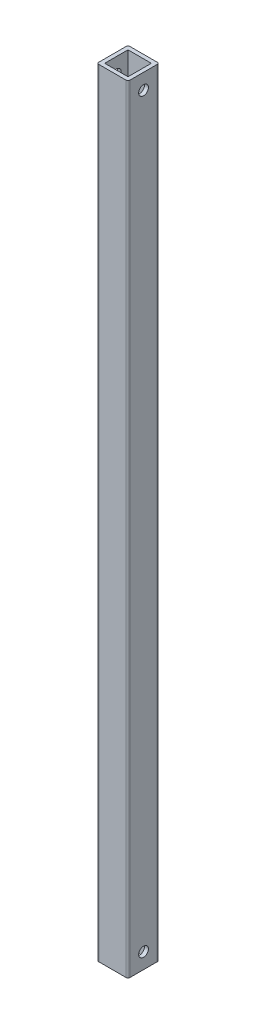
ISO-10303-21;
HEADER;
FILE_DESCRIPTION(('STEP AP214'),'2;1');
FILE_NAME('part.step','',(''),(''),'','','');
FILE_SCHEMA(('AUTOMOTIVE_DESIGN { 1 0 10303 214 1 1 1 1 }'));
ENDSEC;
DATA;
#1=APPLICATION_CONTEXT('core data for automotive mechanical design processes');
#2=APPLICATION_PROTOCOL_DEFINITION('international standard','automotive_design',2000,#1);
#3=PRODUCT_CONTEXT('',#1,'mechanical');
#4=PRODUCT('Part','Part','',(#3));
#5=PRODUCT_RELATED_PRODUCT_CATEGORY('part','',(#4));
#6=PRODUCT_DEFINITION_FORMATION('','',#4);
#7=PRODUCT_DEFINITION_CONTEXT('part definition',#1,'design');
#8=PRODUCT_DEFINITION('design','',#6,#7);
#9=PRODUCT_DEFINITION_SHAPE('','',#8);
#10=(LENGTH_UNIT() NAMED_UNIT(*) SI_UNIT(.MILLI.,.METRE.));
#11=(NAMED_UNIT(*) PLANE_ANGLE_UNIT() SI_UNIT($,.RADIAN.));
#12=(NAMED_UNIT(*) SI_UNIT($,.STERADIAN.) SOLID_ANGLE_UNIT());
#13=UNCERTAINTY_MEASURE_WITH_UNIT(LENGTH_MEASURE(1.E-05),#10,'distance_accuracy_value','');
#14=(GEOMETRIC_REPRESENTATION_CONTEXT(3) GLOBAL_UNCERTAINTY_ASSIGNED_CONTEXT((#13)) GLOBAL_UNIT_ASSIGNED_CONTEXT((#10,
#11,#12)) REPRESENTATION_CONTEXT('',''));
#15=CARTESIAN_POINT('',(0.,0.,0.));
#16=DIRECTION('',(0.,0.,1.));
#17=DIRECTION('',(1.,0.,0.));
#18=AXIS2_PLACEMENT_3D('',#15,#16,#17);
#19=CARTESIAN_POINT('',(0.,400.,0.));
#20=DIRECTION('',(0.,1.,0.));
#21=DIRECTION('',(0.,0.,1.));
#22=AXIS2_PLACEMENT_3D('',#19,#20,#21);
#23=PLANE('',#22);
#24=DIRECTION('',(0.,0.,1.));
#25=VECTOR('',#24,1.);
#26=CARTESIAN_POINT('',(-3.14814814814815,400.,-8.92592592592593));
#27=LINE('',#26,#25);
#28=CARTESIAN_POINT('',(-3.14814814814815,400.,-7.92592592592593));
#29=VERTEX_POINT('',#28);
#30=CARTESIAN_POINT('',(-3.14814814814814,400.,6.07407407407407));
#31=VERTEX_POINT('',#30);
#32=EDGE_CURVE('E198',#29,#31,#27,.T.);
#33=ORIENTED_EDGE('',*,*,#32,.T.);
#34=CARTESIAN_POINT('',(-2.14814814814814,400.,6.07407407407407));
#35=DIRECTION('',(0.,1.,0.));
#36=DIRECTION('',(0.,0.,1.));
#37=AXIS2_PLACEMENT_3D('',#34,#35,#36);
#38=CIRCLE('',#37,1.);
#39=CARTESIAN_POINT('',(-2.14814814814814,400.,7.07407407407407));
#40=VERTEX_POINT('',#39);
#41=EDGE_CURVE('E260',#31,#40,#38,.T.);
#42=ORIENTED_EDGE('',*,*,#41,.T.);
#43=DIRECTION('',(1.,0.,0.));
#44=VECTOR('',#43,1.);
#45=CARTESIAN_POINT('',(-3.14814814814814,400.,7.07407407407407));
#46=LINE('',#45,#44);
#47=CARTESIAN_POINT('',(11.8518518518519,400.,7.07407407407407));
#48=VERTEX_POINT('',#47);
#49=EDGE_CURVE('E202',#40,#48,#46,.T.);
#50=ORIENTED_EDGE('',*,*,#49,.T.);
#51=CARTESIAN_POINT('',(11.8518518518519,400.,6.07407407407407));
#52=DIRECTION('',(0.,1.,0.));
#53=DIRECTION('',(0.,0.,1.));
#54=AXIS2_PLACEMENT_3D('',#51,#52,#53);
#55=CIRCLE('',#54,1.);
#56=CARTESIAN_POINT('',(12.8518518518519,400.,6.07407407407407));
#57=VERTEX_POINT('',#56);
#58=EDGE_CURVE('E252',#48,#57,#55,.T.);
#59=ORIENTED_EDGE('',*,*,#58,.T.);
#60=DIRECTION('',(0.,0.,-1.));
#61=VECTOR('',#60,1.);
#62=CARTESIAN_POINT('',(12.8518518518519,400.,-8.92592592592593));
#63=LINE('',#62,#61);
#64=CARTESIAN_POINT('',(12.8518518518519,400.,-7.92592592592593));
#65=VERTEX_POINT('',#64);
#66=EDGE_CURVE('E207',#57,#65,#63,.T.);
#67=ORIENTED_EDGE('',*,*,#66,.T.);
#68=CARTESIAN_POINT('',(11.8518518518519,400.,-7.92592592592593));
#69=DIRECTION('',(0.,1.,0.));
#70=DIRECTION('',(0.,0.,1.));
#71=AXIS2_PLACEMENT_3D('',#68,#69,#70);
#72=CIRCLE('',#71,1.);
#73=CARTESIAN_POINT('',(11.8518518518519,400.,-8.92592592592593));
#74=VERTEX_POINT('',#73);
#75=EDGE_CURVE('E74',#65,#74,#72,.T.);
#76=ORIENTED_EDGE('',*,*,#75,.T.);
#77=DIRECTION('',(-1.,0.,0.));
#78=VECTOR('',#77,1.);
#79=CARTESIAN_POINT('',(-3.14814814814815,400.,-8.92592592592593));
#80=LINE('',#79,#78);
#81=CARTESIAN_POINT('',(-2.14814814814815,400.,-8.92592592592593));
#82=VERTEX_POINT('',#81);
#83=EDGE_CURVE('E210',#74,#82,#80,.T.);
#84=ORIENTED_EDGE('',*,*,#83,.T.);
#85=CARTESIAN_POINT('',(-2.14814814814815,400.,-7.92592592592593));
#86=DIRECTION('',(0.,1.,0.));
#87=DIRECTION('',(0.,0.,1.));
#88=AXIS2_PLACEMENT_3D('',#85,#86,#87);
#89=CIRCLE('',#88,1.);
#90=EDGE_CURVE('E255',#82,#29,#89,.T.);
#91=ORIENTED_EDGE('',*,*,#90,.T.);
#92=EDGE_LOOP('',(#33,#42,#50,#59,#67,#76,#84,#91));
#93=FACE_BOUND('',#92,.T.);
#94=DIRECTION('',(0.,0.,1.));
#95=VECTOR('',#94,1.);
#96=CARTESIAN_POINT('',(-1.14814814814815,400.,-6.92592592592593));
#97=LINE('',#96,#95);
#98=CARTESIAN_POINT('',(-1.14814814814815,400.,-6.92592592592593));
#99=VERTEX_POINT('',#98);
#100=CARTESIAN_POINT('',(-1.14814814814814,400.,5.07407407407407));
#101=VERTEX_POINT('',#100);
#102=EDGE_CURVE('E154',#99,#101,#97,.T.);
#103=ORIENTED_EDGE('',*,*,#102,.F.);
#104=DIRECTION('',(-1.,0.,0.));
#105=VECTOR('',#104,1.);
#106=CARTESIAN_POINT('',(-1.14814814814815,400.,-6.92592592592593));
#107=LINE('',#106,#105);
#108=CARTESIAN_POINT('',(10.8518518518519,400.,-6.92592592592593));
#109=VERTEX_POINT('',#108);
#110=EDGE_CURVE('E143',#109,#99,#107,.T.);
#111=ORIENTED_EDGE('',*,*,#110,.F.);
#112=DIRECTION('',(0.,0.,-1.));
#113=VECTOR('',#112,1.);
#114=CARTESIAN_POINT('',(10.8518518518519,400.,-6.92592592592593));
#115=LINE('',#114,#113);
#116=CARTESIAN_POINT('',(10.8518518518519,400.,5.07407407407407));
#117=VERTEX_POINT('',#116);
#118=EDGE_CURVE('E172',#117,#109,#115,.T.);
#119=ORIENTED_EDGE('',*,*,#118,.F.);
#120=DIRECTION('',(1.,0.,0.));
#121=VECTOR('',#120,1.);
#122=CARTESIAN_POINT('',(-1.14814814814814,400.,5.07407407407407));
#123=LINE('',#122,#121);
#124=EDGE_CURVE('E168',#101,#117,#123,.T.);
#125=ORIENTED_EDGE('',*,*,#124,.F.);
#126=EDGE_LOOP('',(#103,#111,#119,#125));
#127=FACE_BOUND('',#126,.T.);
#128=ADVANCED_FACE('F49',(#93,#127),#23,.T.);
#129=CARTESIAN_POINT('',(0.,0.,0.));
#130=DIRECTION('',(0.,1.,0.));
#131=DIRECTION('',(0.,0.,1.));
#132=AXIS2_PLACEMENT_3D('',#129,#130,#131);
#133=PLANE('',#132);
#134=DIRECTION('',(1.,0.,0.));
#135=VECTOR('',#134,1.);
#136=CARTESIAN_POINT('',(-3.14814814814814,0.,7.07407407407407));
#137=LINE('',#136,#135);
#138=CARTESIAN_POINT('',(-2.14814814814814,0.,7.07407407407407));
#139=VERTEX_POINT('',#138);
#140=CARTESIAN_POINT('',(11.8518518518519,0.,7.07407407407407));
#141=VERTEX_POINT('',#140);
#142=EDGE_CURVE('E217',#139,#141,#137,.T.);
#143=ORIENTED_EDGE('',*,*,#142,.F.);
#144=CARTESIAN_POINT('',(-2.14814814814814,0.,6.07407407407407));
#145=DIRECTION('',(0.,1.,0.));
#146=DIRECTION('',(0.,0.,1.));
#147=AXIS2_PLACEMENT_3D('',#144,#145,#146);
#148=CIRCLE('',#147,1.);
#149=CARTESIAN_POINT('',(-3.14814814814814,0.,6.07407407407407));
#150=VERTEX_POINT('',#149);
#151=EDGE_CURVE('E242',#139,#150,#148,.F.);
#152=ORIENTED_EDGE('',*,*,#151,.T.);
#153=DIRECTION('',(0.,0.,1.));
#154=VECTOR('',#153,1.);
#155=CARTESIAN_POINT('',(-3.14814814814815,0.,-8.92592592592593));
#156=LINE('',#155,#154);
#157=CARTESIAN_POINT('',(-3.14814814814815,0.,-7.92592592592593));
#158=VERTEX_POINT('',#157);
#159=EDGE_CURVE('E163',#158,#150,#156,.T.);
#160=ORIENTED_EDGE('',*,*,#159,.F.);
#161=CARTESIAN_POINT('',(-2.14814814814815,0.,-7.92592592592593));
#162=DIRECTION('',(0.,1.,0.));
#163=DIRECTION('',(0.,0.,1.));
#164=AXIS2_PLACEMENT_3D('',#161,#162,#163);
#165=CIRCLE('',#164,1.);
#166=CARTESIAN_POINT('',(-2.14814814814815,0.,-8.92592592592593));
#167=VERTEX_POINT('',#166);
#168=EDGE_CURVE('E236',#158,#167,#165,.F.);
#169=ORIENTED_EDGE('',*,*,#168,.T.);
#170=DIRECTION('',(-1.,0.,0.));
#171=VECTOR('',#170,1.);
#172=CARTESIAN_POINT('',(-3.14814814814815,0.,-8.92592592592593));
#173=LINE('',#172,#171);
#174=CARTESIAN_POINT('',(11.8518518518519,0.,-8.92592592592593));
#175=VERTEX_POINT('',#174);
#176=EDGE_CURVE('E203',#175,#167,#173,.T.);
#177=ORIENTED_EDGE('',*,*,#176,.F.);
#178=CARTESIAN_POINT('',(11.8518518518519,0.,-7.92592592592593));
#179=DIRECTION('',(0.,1.,0.));
#180=DIRECTION('',(0.,0.,1.));
#181=AXIS2_PLACEMENT_3D('',#178,#179,#180);
#182=CIRCLE('',#181,1.);
#183=CARTESIAN_POINT('',(12.8518518518519,0.,-7.92592592592593));
#184=VERTEX_POINT('',#183);
#185=EDGE_CURVE('E239',#175,#184,#182,.F.);
#186=ORIENTED_EDGE('',*,*,#185,.T.);
#187=DIRECTION('',(0.,0.,-1.));
#188=VECTOR('',#187,1.);
#189=CARTESIAN_POINT('',(12.8518518518519,0.,-8.92592592592593));
#190=LINE('',#189,#188);
#191=CARTESIAN_POINT('',(12.8518518518519,0.,6.07407407407407));
#192=VERTEX_POINT('',#191);
#193=EDGE_CURVE('E221',#192,#184,#190,.T.);
#194=ORIENTED_EDGE('',*,*,#193,.F.);
#195=CARTESIAN_POINT('',(11.8518518518519,0.,6.07407407407407));
#196=DIRECTION('',(0.,1.,0.));
#197=DIRECTION('',(0.,0.,1.));
#198=AXIS2_PLACEMENT_3D('',#195,#196,#197);
#199=CIRCLE('',#198,1.);
#200=EDGE_CURVE('E233',#192,#141,#199,.F.);
#201=ORIENTED_EDGE('',*,*,#200,.T.);
#202=EDGE_LOOP('',(#143,#152,#160,#169,#177,#186,#194,#201));
#203=FACE_BOUND('',#202,.T.);
#204=DIRECTION('',(-1.,0.,0.));
#205=VECTOR('',#204,1.);
#206=CARTESIAN_POINT('',(-1.14814814814815,0.,-6.92592592592593));
#207=LINE('',#206,#205);
#208=CARTESIAN_POINT('',(10.8518518518519,0.,-6.92592592592593));
#209=VERTEX_POINT('',#208);
#210=CARTESIAN_POINT('',(-1.14814814814815,0.,-6.92592592592593));
#211=VERTEX_POINT('',#210);
#212=EDGE_CURVE('E178',#209,#211,#207,.T.);
#213=ORIENTED_EDGE('',*,*,#212,.T.);
#214=DIRECTION('',(0.,0.,1.));
#215=VECTOR('',#214,1.);
#216=CARTESIAN_POINT('',(-1.14814814814815,0.,-6.92592592592593));
#217=LINE('',#216,#215);
#218=CARTESIAN_POINT('',(-1.14814814814814,0.,5.07407407407407));
#219=VERTEX_POINT('',#218);
#220=EDGE_CURVE('E161',#211,#219,#217,.T.);
#221=ORIENTED_EDGE('',*,*,#220,.T.);
#222=DIRECTION('',(1.,0.,0.));
#223=VECTOR('',#222,1.);
#224=CARTESIAN_POINT('',(-1.14814814814814,0.,5.07407407407407));
#225=LINE('',#224,#223);
#226=CARTESIAN_POINT('',(10.8518518518519,0.,5.07407407407407));
#227=VERTEX_POINT('',#226);
#228=EDGE_CURVE('E184',#219,#227,#225,.T.);
#229=ORIENTED_EDGE('',*,*,#228,.T.);
#230=DIRECTION('',(0.,0.,-1.));
#231=VECTOR('',#230,1.);
#232=CARTESIAN_POINT('',(10.8518518518519,0.,-6.92592592592593));
#233=LINE('',#232,#231);
#234=EDGE_CURVE('E155',#227,#209,#233,.T.);
#235=ORIENTED_EDGE('',*,*,#234,.T.);
#236=EDGE_LOOP('',(#213,#221,#229,#235));
#237=FACE_BOUND('',#236,.T.);
#238=ADVANCED_FACE('F319',(#203,#237),#133,.F.);
#239=CARTESIAN_POINT('',(-3.14814814814815,400.,-8.92592592592593));
#240=DIRECTION('',(1.,0.,0.));
#241=DIRECTION('',(0.,0.,-1.));
#242=AXIS2_PLACEMENT_3D('',#239,#240,#241);
#243=PLANE('',#242);
#244=CARTESIAN_POINT('',(-3.14814814814815,8.00000000000001,-0.925925925925927));
#245=DIRECTION('',(-1.,0.,0.));
#246=DIRECTION('',(0.,0.,1.));
#247=AXIS2_PLACEMENT_3D('',#244,#245,#246);
#248=CIRCLE('',#247,2.5);
#249=CARTESIAN_POINT('',(-3.14814814814815,8.00000000000001,1.57407407407407));
#250=VERTEX_POINT('',#249);
#251=EDGE_CURVE('E283',#250,#250,#248,.T.);
#252=ORIENTED_EDGE('',*,*,#251,.F.);
#253=EDGE_LOOP('',(#252));
#254=FACE_BOUND('',#253,.T.);
#255=CARTESIAN_POINT('',(-3.14814814814815,392.,-0.925925925925927));
#256=DIRECTION('',(-1.,0.,0.));
#257=DIRECTION('',(0.,0.,1.));
#258=AXIS2_PLACEMENT_3D('',#255,#256,#257);
#259=CIRCLE('',#258,2.5);
#260=CARTESIAN_POINT('',(-3.14814814814815,392.,1.57407407407407));
#261=VERTEX_POINT('',#260);
#262=EDGE_CURVE('E289',#261,#261,#259,.T.);
#263=ORIENTED_EDGE('',*,*,#262,.F.);
#264=EDGE_LOOP('',(#263));
#265=FACE_BOUND('',#264,.T.);
#266=ORIENTED_EDGE('',*,*,#159,.T.);
#267=DIRECTION('',(0.,-1.,0.));
#268=VECTOR('',#267,1.);
#269=CARTESIAN_POINT('',(-3.14814814814814,400.,6.07407407407407));
#270=LINE('',#269,#268);
#271=EDGE_CURVE('E249',#150,#31,#270,.F.);
#272=ORIENTED_EDGE('',*,*,#271,.T.);
#273=ORIENTED_EDGE('',*,*,#32,.F.);
#274=DIRECTION('',(0.,-1.,0.));
#275=VECTOR('',#274,1.);
#276=CARTESIAN_POINT('',(-3.14814814814815,400.,-7.92592592592593));
#277=LINE('',#276,#275);
#278=EDGE_CURVE('E245',#29,#158,#277,.T.);
#279=ORIENTED_EDGE('',*,*,#278,.T.);
#280=EDGE_LOOP('',(#266,#272,#273,#279));
#281=FACE_BOUND('',#280,.T.);
#282=ADVANCED_FACE('F333',(#254,#265,#281),#243,.F.);
#283=CARTESIAN_POINT('',(-3.14814814814814,400.,7.07407407407407));
#284=DIRECTION('',(0.,0.,-1.));
#285=DIRECTION('',(-1.,0.,0.));
#286=AXIS2_PLACEMENT_3D('',#283,#284,#285);
#287=PLANE('',#286);
#288=ORIENTED_EDGE('',*,*,#49,.F.);
#289=DIRECTION('',(0.,-1.,0.));
#290=VECTOR('',#289,1.);
#291=CARTESIAN_POINT('',(-2.14814814814814,400.,7.07407407407407));
#292=LINE('',#291,#290);
#293=EDGE_CURVE('E229',#40,#139,#292,.T.);
#294=ORIENTED_EDGE('',*,*,#293,.T.);
#295=ORIENTED_EDGE('',*,*,#142,.T.);
#296=DIRECTION('',(0.,-1.,0.));
#297=VECTOR('',#296,1.);
#298=CARTESIAN_POINT('',(11.8518518518519,400.,7.07407407407407));
#299=LINE('',#298,#297);
#300=EDGE_CURVE('E213',#141,#48,#299,.F.);
#301=ORIENTED_EDGE('',*,*,#300,.T.);
#302=EDGE_LOOP('',(#288,#294,#295,#301));
#303=FACE_BOUND('',#302,.T.);
#304=ADVANCED_FACE('F344',(#303),#287,.F.);
#305=CARTESIAN_POINT('',(12.8518518518519,400.,-8.92592592592593));
#306=DIRECTION('',(-1.,0.,0.));
#307=DIRECTION('',(0.,0.,1.));
#308=AXIS2_PLACEMENT_3D('',#305,#306,#307);
#309=PLANE('',#308);
#310=CARTESIAN_POINT('',(12.8518518518519,8.00000000000001,-0.925925925925929));
#311=DIRECTION('',(-1.,0.,0.));
#312=DIRECTION('',(0.,0.,1.));
#313=AXIS2_PLACEMENT_3D('',#310,#311,#312);
#314=CIRCLE('',#313,2.5);
#315=CARTESIAN_POINT('',(12.8518518518519,8.00000000000001,1.57407407407407));
#316=VERTEX_POINT('',#315);
#317=EDGE_CURVE('E275',#316,#316,#314,.T.);
#318=ORIENTED_EDGE('',*,*,#317,.T.);
#319=EDGE_LOOP('',(#318));
#320=FACE_BOUND('',#319,.T.);
#321=CARTESIAN_POINT('',(12.8518518518519,392.,-0.925925925925929));
#322=DIRECTION('',(-1.,0.,0.));
#323=DIRECTION('',(0.,0.,1.));
#324=AXIS2_PLACEMENT_3D('',#321,#322,#323);
#325=CIRCLE('',#324,2.5);
#326=CARTESIAN_POINT('',(12.8518518518519,392.,1.57407407407407));
#327=VERTEX_POINT('',#326);
#328=EDGE_CURVE('E295',#327,#327,#325,.T.);
#329=ORIENTED_EDGE('',*,*,#328,.T.);
#330=EDGE_LOOP('',(#329));
#331=FACE_BOUND('',#330,.T.);
#332=ORIENTED_EDGE('',*,*,#193,.T.);
#333=DIRECTION('',(0.,-1.,0.));
#334=VECTOR('',#333,1.);
#335=CARTESIAN_POINT('',(12.8518518518519,400.,-7.92592592592593));
#336=LINE('',#335,#334);
#337=EDGE_CURVE('E11',#184,#65,#336,.F.);
#338=ORIENTED_EDGE('',*,*,#337,.T.);
#339=ORIENTED_EDGE('',*,*,#66,.F.);
#340=DIRECTION('',(0.,-1.,0.));
#341=VECTOR('',#340,1.);
#342=CARTESIAN_POINT('',(12.8518518518519,400.,6.07407407407407));
#343=LINE('',#342,#341);
#344=EDGE_CURVE('E59',#57,#192,#343,.T.);
#345=ORIENTED_EDGE('',*,*,#344,.T.);
#346=EDGE_LOOP('',(#332,#338,#339,#345));
#347=FACE_BOUND('',#346,.T.);
#348=ADVANCED_FACE('F341',(#320,#331,#347),#309,.F.);
#349=CARTESIAN_POINT('',(-3.14814814814815,400.,-8.92592592592593));
#350=DIRECTION('',(0.,0.,1.));
#351=DIRECTION('',(1.,0.,0.));
#352=AXIS2_PLACEMENT_3D('',#349,#350,#351);
#353=PLANE('',#352);
#354=ORIENTED_EDGE('',*,*,#83,.F.);
#355=DIRECTION('',(0.,-1.,0.));
#356=VECTOR('',#355,1.);
#357=CARTESIAN_POINT('',(11.8518518518519,400.,-8.92592592592593));
#358=LINE('',#357,#356);
#359=EDGE_CURVE('E265',#74,#175,#358,.T.);
#360=ORIENTED_EDGE('',*,*,#359,.T.);
#361=ORIENTED_EDGE('',*,*,#176,.T.);
#362=DIRECTION('',(0.,-1.,0.));
#363=VECTOR('',#362,1.);
#364=CARTESIAN_POINT('',(-2.14814814814815,400.,-8.92592592592593));
#365=LINE('',#364,#363);
#366=EDGE_CURVE('E67',#167,#82,#365,.F.);
#367=ORIENTED_EDGE('',*,*,#366,.T.);
#368=EDGE_LOOP('',(#354,#360,#361,#367));
#369=FACE_BOUND('',#368,.T.);
#370=ADVANCED_FACE('F338',(#369),#353,.F.);
#371=CARTESIAN_POINT('',(-1.14814814814815,400.,-6.92592592592593));
#372=DIRECTION('',(0.,0.,1.));
#373=DIRECTION('',(1.,0.,0.));
#374=AXIS2_PLACEMENT_3D('',#371,#372,#373);
#375=PLANE('',#374);
#376=ORIENTED_EDGE('',*,*,#212,.F.);
#377=DIRECTION('',(0.,-1.,0.));
#378=VECTOR('',#377,1.);
#379=CARTESIAN_POINT('',(10.8518518518519,400.,-6.92592592592593));
#380=LINE('',#379,#378);
#381=EDGE_CURVE('E149',#109,#209,#380,.T.);
#382=ORIENTED_EDGE('',*,*,#381,.F.);
#383=ORIENTED_EDGE('',*,*,#110,.T.);
#384=DIRECTION('',(0.,-1.,0.));
#385=VECTOR('',#384,1.);
#386=CARTESIAN_POINT('',(-1.14814814814815,400.,-6.92592592592593));
#387=LINE('',#386,#385);
#388=EDGE_CURVE('E146',#99,#211,#387,.T.);
#389=ORIENTED_EDGE('',*,*,#388,.T.);
#390=EDGE_LOOP('',(#376,#382,#383,#389));
#391=FACE_BOUND('',#390,.T.);
#392=ADVANCED_FACE('F145',(#391),#375,.T.);
#393=CARTESIAN_POINT('',(-1.14814814814815,400.,-6.92592592592593));
#394=DIRECTION('',(1.,0.,0.));
#395=DIRECTION('',(0.,0.,-1.));
#396=AXIS2_PLACEMENT_3D('',#393,#394,#395);
#397=PLANE('',#396);
#398=CARTESIAN_POINT('',(-1.14814814814815,8.00000000000001,-0.925925925925927));
#399=DIRECTION('',(1.,0.,0.));
#400=DIRECTION('',(0.,0.,-1.));
#401=AXIS2_PLACEMENT_3D('',#398,#399,#400);
#402=CIRCLE('',#401,2.5);
#403=CARTESIAN_POINT('',(-1.14814814814815,8.00000000000001,-3.42592592592593));
#404=VERTEX_POINT('',#403);
#405=EDGE_CURVE('E181',#404,#404,#402,.T.);
#406=ORIENTED_EDGE('',*,*,#405,.F.);
#407=EDGE_LOOP('',(#406));
#408=FACE_BOUND('',#407,.T.);
#409=CARTESIAN_POINT('',(-1.14814814814815,392.,-0.925925925925927));
#410=DIRECTION('',(1.,0.,0.));
#411=DIRECTION('',(0.,0.,-1.));
#412=AXIS2_PLACEMENT_3D('',#409,#410,#411);
#413=CIRCLE('',#412,2.5);
#414=CARTESIAN_POINT('',(-1.14814814814815,392.,-3.42592592592593));
#415=VERTEX_POINT('',#414);
#416=EDGE_CURVE('E274',#415,#415,#413,.T.);
#417=ORIENTED_EDGE('',*,*,#416,.F.);
#418=EDGE_LOOP('',(#417));
#419=FACE_BOUND('',#418,.T.);
#420=ORIENTED_EDGE('',*,*,#220,.F.);
#421=ORIENTED_EDGE('',*,*,#388,.F.);
#422=ORIENTED_EDGE('',*,*,#102,.T.);
#423=DIRECTION('',(0.,-1.,0.));
#424=VECTOR('',#423,1.);
#425=CARTESIAN_POINT('',(-1.14814814814814,400.,5.07407407407407));
#426=LINE('',#425,#424);
#427=EDGE_CURVE('E164',#101,#219,#426,.T.);
#428=ORIENTED_EDGE('',*,*,#427,.T.);
#429=EDGE_LOOP('',(#420,#421,#422,#428));
#430=FACE_BOUND('',#429,.T.);
#431=ADVANCED_FACE('F158',(#408,#419,#430),#397,.T.);
#432=CARTESIAN_POINT('',(-1.14814814814814,400.,5.07407407407407));
#433=DIRECTION('',(0.,0.,-1.));
#434=DIRECTION('',(-1.,0.,0.));
#435=AXIS2_PLACEMENT_3D('',#432,#433,#434);
#436=PLANE('',#435);
#437=ORIENTED_EDGE('',*,*,#228,.F.);
#438=ORIENTED_EDGE('',*,*,#427,.F.);
#439=ORIENTED_EDGE('',*,*,#124,.T.);
#440=DIRECTION('',(0.,-1.,0.));
#441=VECTOR('',#440,1.);
#442=CARTESIAN_POINT('',(10.8518518518519,400.,5.07407407407407));
#443=LINE('',#442,#441);
#444=EDGE_CURVE('E193',#117,#227,#443,.T.);
#445=ORIENTED_EDGE('',*,*,#444,.T.);
#446=EDGE_LOOP('',(#437,#438,#439,#445));
#447=FACE_BOUND('',#446,.T.);
#448=ADVANCED_FACE('F313',(#447),#436,.T.);
#449=CARTESIAN_POINT('',(10.8518518518519,400.,-6.92592592592593));
#450=DIRECTION('',(-1.,0.,0.));
#451=DIRECTION('',(0.,0.,1.));
#452=AXIS2_PLACEMENT_3D('',#449,#450,#451);
#453=PLANE('',#452);
#454=CARTESIAN_POINT('',(10.8518518518519,8.00000000000001,-0.925925925925928));
#455=DIRECTION('',(-1.,0.,0.));
#456=DIRECTION('',(0.,0.,1.));
#457=AXIS2_PLACEMENT_3D('',#454,#455,#456);
#458=CIRCLE('',#457,2.5);
#459=CARTESIAN_POINT('',(10.8518518518519,8.00000000000001,1.57407407407407));
#460=VERTEX_POINT('',#459);
#461=EDGE_CURVE('E53',#460,#460,#458,.T.);
#462=ORIENTED_EDGE('',*,*,#461,.F.);
#463=EDGE_LOOP('',(#462));
#464=FACE_BOUND('',#463,.T.);
#465=CARTESIAN_POINT('',(10.8518518518519,392.,-0.925925925925928));
#466=DIRECTION('',(-1.,0.,0.));
#467=DIRECTION('',(0.,0.,1.));
#468=AXIS2_PLACEMENT_3D('',#465,#466,#467);
#469=CIRCLE('',#468,2.5);
#470=CARTESIAN_POINT('',(10.8518518518519,392.,1.57407407407407));
#471=VERTEX_POINT('',#470);
#472=EDGE_CURVE('E271',#471,#471,#469,.T.);
#473=ORIENTED_EDGE('',*,*,#472,.F.);
#474=EDGE_LOOP('',(#473));
#475=FACE_BOUND('',#474,.T.);
#476=ORIENTED_EDGE('',*,*,#234,.F.);
#477=ORIENTED_EDGE('',*,*,#444,.F.);
#478=ORIENTED_EDGE('',*,*,#118,.T.);
#479=ORIENTED_EDGE('',*,*,#381,.T.);
#480=EDGE_LOOP('',(#476,#477,#478,#479));
#481=FACE_BOUND('',#480,.T.);
#482=ADVANCED_FACE('F309',(#464,#475,#481),#453,.T.);
#483=CARTESIAN_POINT('',(-2.14814814814814,400.,6.07407407407407));
#484=DIRECTION('',(0.,-1.,0.));
#485=DIRECTION('',(0.,0.,-1.));
#486=AXIS2_PLACEMENT_3D('',#483,#484,#485);
#487=CYLINDRICAL_SURFACE('',#486,1.);
#488=ORIENTED_EDGE('',*,*,#41,.F.);
#489=ORIENTED_EDGE('',*,*,#271,.F.);
#490=ORIENTED_EDGE('',*,*,#151,.F.);
#491=ORIENTED_EDGE('',*,*,#293,.F.);
#492=EDGE_LOOP('',(#488,#489,#490,#491));
#493=FACE_BOUND('',#492,.T.);
#494=ADVANCED_FACE('F312',(#493),#487,.T.);
#495=CARTESIAN_POINT('',(11.8518518518519,400.,-7.92592592592593));
#496=DIRECTION('',(0.,-1.,0.));
#497=DIRECTION('',(0.,0.,-1.));
#498=AXIS2_PLACEMENT_3D('',#495,#496,#497);
#499=CYLINDRICAL_SURFACE('',#498,1.);
#500=ORIENTED_EDGE('',*,*,#75,.F.);
#501=ORIENTED_EDGE('',*,*,#337,.F.);
#502=ORIENTED_EDGE('',*,*,#185,.F.);
#503=ORIENTED_EDGE('',*,*,#359,.F.);
#504=EDGE_LOOP('',(#500,#501,#502,#503));
#505=FACE_BOUND('',#504,.T.);
#506=ADVANCED_FACE('F353',(#505),#499,.T.);
#507=CARTESIAN_POINT('',(-2.14814814814815,400.,-7.92592592592593));
#508=DIRECTION('',(0.,-1.,0.));
#509=DIRECTION('',(0.,0.,-1.));
#510=AXIS2_PLACEMENT_3D('',#507,#508,#509);
#511=CYLINDRICAL_SURFACE('',#510,1.);
#512=ORIENTED_EDGE('',*,*,#90,.F.);
#513=ORIENTED_EDGE('',*,*,#366,.F.);
#514=ORIENTED_EDGE('',*,*,#168,.F.);
#515=ORIENTED_EDGE('',*,*,#278,.F.);
#516=EDGE_LOOP('',(#512,#513,#514,#515));
#517=FACE_BOUND('',#516,.T.);
#518=ADVANCED_FACE('F356',(#517),#511,.T.);
#519=CARTESIAN_POINT('',(11.8518518518519,400.,6.07407407407407));
#520=DIRECTION('',(0.,-1.,0.));
#521=DIRECTION('',(0.,0.,-1.));
#522=AXIS2_PLACEMENT_3D('',#519,#520,#521);
#523=CYLINDRICAL_SURFACE('',#522,1.);
#524=ORIENTED_EDGE('',*,*,#58,.F.);
#525=ORIENTED_EDGE('',*,*,#300,.F.);
#526=ORIENTED_EDGE('',*,*,#200,.F.);
#527=ORIENTED_EDGE('',*,*,#344,.F.);
#528=EDGE_LOOP('',(#524,#525,#526,#527));
#529=FACE_BOUND('',#528,.T.);
#530=ADVANCED_FACE('F51',(#529),#523,.T.);
#531=CARTESIAN_POINT('',(12.8518518518519,392.,-0.925925925925929));
#532=DIRECTION('',(-1.,0.,0.));
#533=DIRECTION('',(0.,0.,1.));
#534=AXIS2_PLACEMENT_3D('',#531,#532,#533);
#535=CYLINDRICAL_SURFACE('',#534,2.5);
#536=ORIENTED_EDGE('',*,*,#472,.T.);
#537=EDGE_LOOP('',(#536));
#538=FACE_BOUND('',#537,.T.);
#539=ORIENTED_EDGE('',*,*,#328,.F.);
#540=EDGE_LOOP('',(#539));
#541=FACE_BOUND('',#540,.T.);
#542=ADVANCED_FACE('F363',(#538,#541),#535,.F.);
#543=CARTESIAN_POINT('',(12.8518518518519,8.00000000000001,-0.925925925925929));
#544=DIRECTION('',(-1.,0.,0.));
#545=DIRECTION('',(0.,0.,1.));
#546=AXIS2_PLACEMENT_3D('',#543,#544,#545);
#547=CYLINDRICAL_SURFACE('',#546,2.5);
#548=ORIENTED_EDGE('',*,*,#461,.T.);
#549=EDGE_LOOP('',(#548));
#550=FACE_BOUND('',#549,.T.);
#551=ORIENTED_EDGE('',*,*,#317,.F.);
#552=EDGE_LOOP('',(#551));
#553=FACE_BOUND('',#552,.T.);
#554=ADVANCED_FACE('F306',(#550,#553),#547,.F.);
#555=ORIENTED_EDGE('',*,*,#416,.T.);
#556=EDGE_LOOP('',(#555));
#557=FACE_BOUND('',#556,.T.);
#558=ORIENTED_EDGE('',*,*,#262,.T.);
#559=EDGE_LOOP('',(#558));
#560=FACE_BOUND('',#559,.T.);
#561=ADVANCED_FACE('F389',(#557,#560),#535,.F.);
#562=ORIENTED_EDGE('',*,*,#405,.T.);
#563=EDGE_LOOP('',(#562));
#564=FACE_BOUND('',#563,.T.);
#565=ORIENTED_EDGE('',*,*,#251,.T.);
#566=EDGE_LOOP('',(#565));
#567=FACE_BOUND('',#566,.T.);
#568=ADVANCED_FACE('F394',(#564,#567),#547,.F.);
#569=CLOSED_SHELL('',(#128,#238,#282,#304,#348,#370,#392,#431,#448,#482,#494,#506,#518,#530,
#542,#554,#561,#568));
#570=MANIFOLD_SOLID_BREP('B2',#569);
#571=ADVANCED_BREP_SHAPE_REPRESENTATION('',(#18,#570),#14);
#572=SHAPE_DEFINITION_REPRESENTATION(#9,#571);
ENDSEC;
END-ISO-10303-21;
